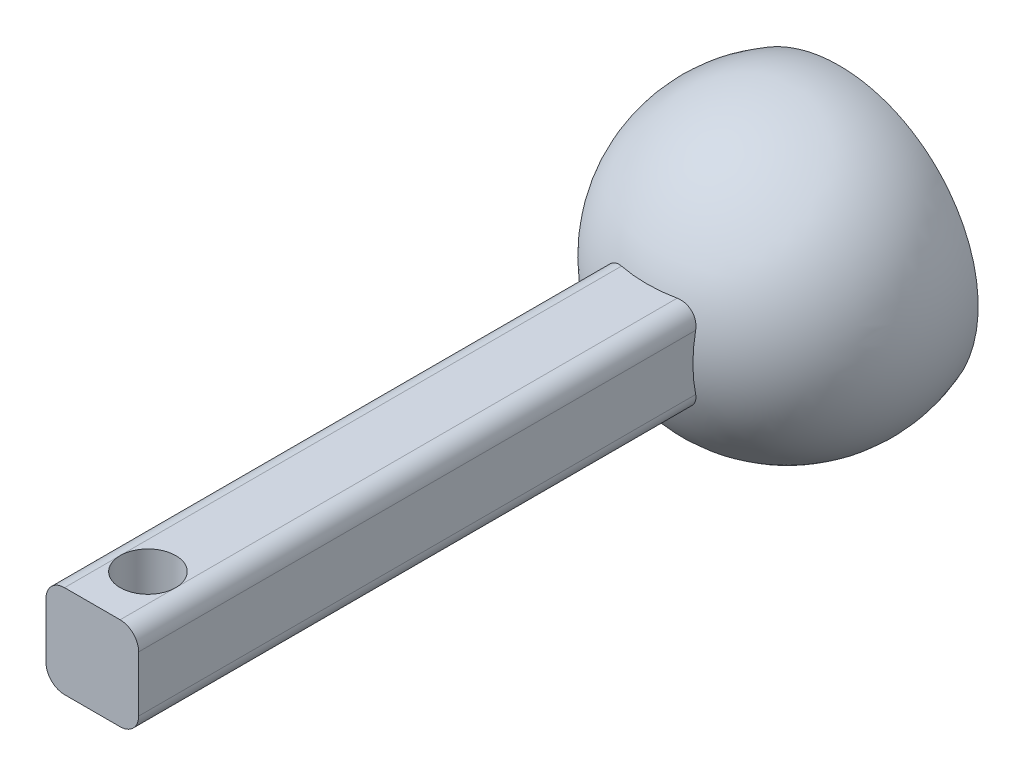
ISO-10303-21;
HEADER;
FILE_DESCRIPTION(('STEP AP214'),'2;1');
FILE_NAME('part.step','',(''),(''),'','','');
FILE_SCHEMA(('AUTOMOTIVE_DESIGN { 1 0 10303 214 1 1 1 1 }'));
ENDSEC;
DATA;
#1=APPLICATION_CONTEXT('core data for automotive mechanical design processes');
#2=APPLICATION_PROTOCOL_DEFINITION('international standard','automotive_design',2000,#1);
#3=PRODUCT_CONTEXT('',#1,'mechanical');
#4=PRODUCT('Part','Part','',(#3));
#5=PRODUCT_RELATED_PRODUCT_CATEGORY('part','',(#4));
#6=PRODUCT_DEFINITION_FORMATION('','',#4);
#7=PRODUCT_DEFINITION_CONTEXT('part definition',#1,'design');
#8=PRODUCT_DEFINITION('design','',#6,#7);
#9=PRODUCT_DEFINITION_SHAPE('','',#8);
#10=(LENGTH_UNIT() NAMED_UNIT(*) SI_UNIT(.MILLI.,.METRE.));
#11=(NAMED_UNIT(*) PLANE_ANGLE_UNIT() SI_UNIT($,.RADIAN.));
#12=(NAMED_UNIT(*) SI_UNIT($,.STERADIAN.) SOLID_ANGLE_UNIT());
#13=UNCERTAINTY_MEASURE_WITH_UNIT(LENGTH_MEASURE(1.E-05),#10,'distance_accuracy_value','');
#14=(GEOMETRIC_REPRESENTATION_CONTEXT(3) GLOBAL_UNCERTAINTY_ASSIGNED_CONTEXT((#13)) GLOBAL_UNIT_ASSIGNED_CONTEXT((#10,
#11,#12)) REPRESENTATION_CONTEXT('',''));
#15=CARTESIAN_POINT('',(0.,0.,0.));
#16=DIRECTION('',(0.,0.,1.));
#17=DIRECTION('',(1.,0.,0.));
#18=AXIS2_PLACEMENT_3D('',#15,#16,#17);
#19=CARTESIAN_POINT('',(1.90972222222197,4.70138888888889,37.5));
#20=DIRECTION('',(0.,-1.,0.));
#21=DIRECTION('',(0.,0.,-1.));
#22=AXIS2_PLACEMENT_3D('',#19,#20,#21);
#23=PLANE('',#22);
#24=DIRECTION('',(-1.,0.,0.));
#25=VECTOR('',#24,1.);
#26=CARTESIAN_POINT('',(1.90972222222197,4.70138888888889,37.5));
#27=LINE('',#26,#25);
#28=CARTESIAN_POINT('',(0.909722222221967,4.70138888888889,37.5));
#29=VERTEX_POINT('',#28);
#30=CARTESIAN_POINT('',(-2.09027777777803,4.70138888888889,37.5));
#31=VERTEX_POINT('',#30);
#32=EDGE_CURVE('E196',#29,#31,#27,.T.);
#33=ORIENTED_EDGE('',*,*,#32,.T.);
#34=DIRECTION('',(0.,0.,-1.));
#35=VECTOR('',#34,1.);
#36=CARTESIAN_POINT('',(-2.09027777777803,4.70138888888889,37.5));
#37=LINE('',#36,#35);
#38=CARTESIAN_POINT('',(-2.09027777777801,4.70138888888889,34.5));
#39=VERTEX_POINT('',#38);
#40=EDGE_CURVE('E188',#31,#39,#37,.T.);
#41=ORIENTED_EDGE('',*,*,#40,.T.);
#42=CARTESIAN_POINT('',(-0.590277777778033,4.70138888888889,34.5));
#43=DIRECTION('',(0.,-1.,0.));
#44=DIRECTION('',(0.,0.,-1.));
#45=AXIS2_PLACEMENT_3D('',#42,#43,#44);
#46=CIRCLE('',#45,1.5);
#47=CARTESIAN_POINT('',(0.909722222221988,4.70138888888889,34.5));
#48=VERTEX_POINT('',#47);
#49=EDGE_CURVE('E225',#48,#39,#46,.T.);
#50=ORIENTED_EDGE('',*,*,#49,.F.);
#51=DIRECTION('',(0.,0.,-1.));
#52=VECTOR('',#51,1.);
#53=CARTESIAN_POINT('',(0.909722222221967,4.70138888888889,37.5));
#54=LINE('',#53,#52);
#55=EDGE_CURVE('E174',#48,#29,#54,.F.);
#56=ORIENTED_EDGE('',*,*,#55,.T.);
#57=EDGE_LOOP('',(#33,#41,#50,#56));
#58=FACE_BOUND('',#57,.T.);
#59=ADVANCED_FACE('F33',(#58),#23,.T.);
#60=CARTESIAN_POINT('',(1.90972222222197,9.70138888888889,37.5));
#61=DIRECTION('',(0.,1.,0.));
#62=DIRECTION('',(0.,0.,1.));
#63=AXIS2_PLACEMENT_3D('',#60,#61,#62);
#64=PLANE('',#63);
#65=DIRECTION('',(1.,0.,0.));
#66=VECTOR('',#65,1.);
#67=CARTESIAN_POINT('',(1.90972222222197,9.70138888888889,37.5));
#68=LINE('',#67,#66);
#69=CARTESIAN_POINT('',(-2.09027777777803,9.70138888888889,37.5));
#70=VERTEX_POINT('',#69);
#71=CARTESIAN_POINT('',(0.909722222221968,9.70138888888889,37.5));
#72=VERTEX_POINT('',#71);
#73=EDGE_CURVE('E220',#70,#72,#68,.T.);
#74=ORIENTED_EDGE('',*,*,#73,.T.);
#75=DIRECTION('',(0.,0.,-1.));
#76=VECTOR('',#75,1.);
#77=CARTESIAN_POINT('',(0.909722222221968,9.70138888888889,37.5));
#78=LINE('',#77,#76);
#79=CARTESIAN_POINT('',(0.909722222221989,9.70138888888889,34.5));
#80=VERTEX_POINT('',#79);
#81=EDGE_CURVE('E237',#72,#80,#78,.T.);
#82=ORIENTED_EDGE('',*,*,#81,.T.);
#83=CARTESIAN_POINT('',(-0.590277777778033,9.70138888888889,34.5));
#84=DIRECTION('',(0.,-1.,0.));
#85=DIRECTION('',(0.,0.,-1.));
#86=AXIS2_PLACEMENT_3D('',#83,#84,#85);
#87=CIRCLE('',#86,1.5);
#88=CARTESIAN_POINT('',(-2.09027777777801,9.70138888888889,34.5));
#89=VERTEX_POINT('',#88);
#90=EDGE_CURVE('E227',#80,#89,#87,.T.);
#91=ORIENTED_EDGE('',*,*,#90,.T.);
#92=DIRECTION('',(0.,0.,-1.));
#93=VECTOR('',#92,1.);
#94=CARTESIAN_POINT('',(-2.09027777777803,9.70138888888889,37.5));
#95=LINE('',#94,#93);
#96=EDGE_CURVE('E137',#89,#70,#95,.F.);
#97=ORIENTED_EDGE('',*,*,#96,.T.);
#98=EDGE_LOOP('',(#74,#82,#91,#97));
#99=FACE_BOUND('',#98,.T.);
#100=ADVANCED_FACE('F234',(#99),#64,.T.);
#101=CARTESIAN_POINT('',(-0.590277777777771,7.20138888888889,0.));
#102=DIRECTION('',(0.,1.,0.));
#103=DIRECTION('',(-1.,0.,0.));
#104=AXIS2_PLACEMENT_3D('',#101,#102,#103);
#105=SPHERICAL_SURFACE('',#104,8.);
#106=CARTESIAN_POINT('',(1.90972222222223,7.20138888888889,0.));
#107=DIRECTION('',(1.,0.,0.));
#108=DIRECTION('',(0.,0.,-1.));
#109=AXIS2_PLACEMENT_3D('',#106,#107,#108);
#110=CIRCLE('',#109,7.59934207678533);
#111=CARTESIAN_POINT('',(1.90972222222218,8.70138888888889,7.44983221287569));
#112=VERTEX_POINT('',#111);
#113=CARTESIAN_POINT('',(1.90972222222218,5.70138888888889,7.44983221287569));
#114=VERTEX_POINT('',#113);
#115=EDGE_CURVE('E213',#112,#114,#110,.T.);
#116=ORIENTED_EDGE('',*,*,#115,.T.);
#117=CARTESIAN_POINT('',(1.90972222222218,5.70138888888889,7.44983221287569));
#118=CARTESIAN_POINT('',(1.90972187952674,5.67401608297487,7.44432086557203));
#119=CARTESIAN_POINT('',(1.90859752282679,5.64661207920893,7.4390234146982));
#120=CARTESIAN_POINT('',(1.90408975405537,5.59190063470269,7.42889347449714));
#121=CARTESIAN_POINT('',(1.90070603824714,5.56459320744193,7.42406104778535));
#122=CARTESIAN_POINT('',(1.8871545453131,5.48309417147811,7.41032406944411));
#123=CARTESIAN_POINT('',(1.87358644409308,5.42929646140758,7.40217390010411));
#124=CARTESIAN_POINT('',(1.83759111737496,5.32436974699586,7.38819228477517));
#125=CARTESIAN_POINT('',(1.81515183130401,5.27324448348864,7.38236401721117));
#126=CARTESIAN_POINT('',(1.76196698992378,5.17528972496734,7.37326176833674));
#127=CARTESIAN_POINT('',(1.73122666988414,5.12845754725445,7.36998618215187));
#128=CARTESIAN_POINT('',(1.66305627572989,5.04148400928918,7.36615821402901));
#129=CARTESIAN_POINT('',(1.62578803100067,5.00121824656301,7.36554757867138));
#130=CARTESIAN_POINT('',(1.54519446237612,4.92733264834072,7.36691353307779));
#131=CARTESIAN_POINT('',(1.50186869546854,4.89371329935948,7.36889031215891));
#132=CARTESIAN_POINT('',(1.41094871784058,4.83438962278865,7.37531916336286));
#133=CARTESIAN_POINT('',(1.36340586145067,4.80860345596496,7.37974417422791));
#134=CARTESIAN_POINT('',(1.26501170452694,4.76508643746949,7.39089000393251));
#135=CARTESIAN_POINT('',(1.21416034745024,4.74735572350822,7.39761086201687));
#136=CARTESIAN_POINT('',(1.12096500103,4.72301757045456,7.41155826367819));
#137=CARTESIAN_POINT('',(1.07895217399709,4.71489518863995,7.41841521879768));
#138=CARTESIAN_POINT('',(0.994500082224868,4.70407815911373,7.43328928099236));
#139=CARTESIAN_POINT('',(0.952061543510614,4.70137546797849,7.4413046498695));
#140=CARTESIAN_POINT('',(0.909722222222177,4.70138888888889,7.44983221287568));
#141=B_SPLINE_CURVE_WITH_KNOTS('',3,(#117,#118,#119,#120,#121,#122,#123,#124,#125,#126,#127,
#128,#129,#130,#131,#132,#133,#134,#135,#136,#137,#138,#139,#140),.UNSPECIFIED.,.F.,.F.,(4,2,2,
2,2,2,2,2,2,2,2,4),(0.,0.0837187567447226,0.167448770480679,0.334820094500676,0.502419750395049,
0.669913950947328,0.833727934721913,0.997553905179925,1.15960421039522,1.32165728580771,
1.45131918122507,1.58078850112919),.UNSPECIFIED.);
#142=CARTESIAN_POINT('',(0.909722222222177,4.70138888888889,7.44983221287568));
#143=VERTEX_POINT('',#142);
#144=EDGE_CURVE('E181',#114,#143,#141,.T.);
#145=ORIENTED_EDGE('',*,*,#144,.T.);
#146=CARTESIAN_POINT('',(-0.590277777777771,4.70138888888889,0.));
#147=DIRECTION('',(0.,-1.,0.));
#148=DIRECTION('',(0.,0.,-1.));
#149=AXIS2_PLACEMENT_3D('',#146,#147,#148);
#150=CIRCLE('',#149,7.59934207678533);
#151=CARTESIAN_POINT('',(-2.09027777777782,4.70138888888889,7.44983221287566));
#152=VERTEX_POINT('',#151);
#153=EDGE_CURVE('E121',#143,#152,#150,.T.);
#154=ORIENTED_EDGE('',*,*,#153,.T.);
#155=CARTESIAN_POINT('',(-2.09027777777782,4.70138888888889,7.44983221287566));
#156=CARTESIAN_POINT('',(-2.11765058369184,4.70138923158433,7.444320865572));
#157=CARTESIAN_POINT('',(-2.14505458745779,4.70251358828428,7.43902341469817));
#158=CARTESIAN_POINT('',(-2.19976603196402,4.7070213570557,7.42889347449711));
#159=CARTESIAN_POINT('',(-2.22707345922479,4.71040507286393,7.42406104778532));
#160=CARTESIAN_POINT('',(-2.3085724951886,4.72395656579797,7.41032406944408));
#161=CARTESIAN_POINT('',(-2.36237020525914,4.73752466701799,7.40217390010408));
#162=CARTESIAN_POINT('',(-2.46729691967086,4.77351999373611,7.38819228477514));
#163=CARTESIAN_POINT('',(-2.51842218317807,4.79595927980706,7.38236401721114));
#164=CARTESIAN_POINT('',(-2.61637694169938,4.84914412118729,7.37326176833671));
#165=CARTESIAN_POINT('',(-2.66320911941227,4.87988444122693,7.36998618215184));
#166=CARTESIAN_POINT('',(-2.75018265737753,4.94805483538118,7.36615821402898));
#167=CARTESIAN_POINT('',(-2.7904484201037,4.9853230801104,7.36554757867135));
#168=CARTESIAN_POINT('',(-2.864334018326,5.06591664873495,7.36691353307776));
#169=CARTESIAN_POINT('',(-2.89795336730723,5.10924241564253,7.36889031215888));
#170=CARTESIAN_POINT('',(-2.95727704387807,5.20016239327049,7.37531916336284));
#171=CARTESIAN_POINT('',(-2.98306321070175,5.2477052496604,7.37974417422788));
#172=CARTESIAN_POINT('',(-3.02658022919722,5.34609940658413,7.39089000393248));
#173=CARTESIAN_POINT('',(-3.04431094315849,5.39695076366083,7.39761086201684));
#174=CARTESIAN_POINT('',(-3.06864909621216,5.49014611008107,7.41155826367816));
#175=CARTESIAN_POINT('',(-3.07677147802676,5.53215893711398,7.41841521879765));
#176=CARTESIAN_POINT('',(-3.08758850755298,5.6166110288862,7.43328928099233));
#177=CARTESIAN_POINT('',(-3.09029119868822,5.65904956760046,7.44130464986947));
#178=CARTESIAN_POINT('',(-3.09027777777782,5.70138888888889,7.44983221287565));
#179=B_SPLINE_CURVE_WITH_KNOTS('',3,(#155,#156,#157,#158,#159,#160,#161,#162,#163,#164,#165,
#166,#167,#168,#169,#170,#171,#172,#173,#174,#175,#176,#177,#178),.UNSPECIFIED.,.F.,.F.,(4,2,2,
2,2,2,2,2,2,2,2,4),(0.,0.0837187567447233,0.167448770480679,0.334820094500676,0.502419750395046,
0.669913950947327,0.833727934721913,0.997553905179924,1.15960421039522,1.32165728580771,
1.45131918122507,1.58078850112919),.UNSPECIFIED.);
#180=CARTESIAN_POINT('',(-3.09027777777782,5.70138888888889,7.44983221287565));
#181=VERTEX_POINT('',#180);
#182=EDGE_CURVE('E11',#152,#181,#179,.T.);
#183=ORIENTED_EDGE('',*,*,#182,.T.);
#184=CARTESIAN_POINT('',(-3.09027777777777,7.20138888888889,0.));
#185=DIRECTION('',(-1.,0.,0.));
#186=DIRECTION('',(0.,0.,1.));
#187=AXIS2_PLACEMENT_3D('',#184,#185,#186);
#188=CIRCLE('',#187,7.59934207678533);
#189=CARTESIAN_POINT('',(-3.09027777777782,8.70138888888889,7.44983221287565));
#190=VERTEX_POINT('',#189);
#191=EDGE_CURVE('E111',#181,#190,#188,.T.);
#192=ORIENTED_EDGE('',*,*,#191,.T.);
#193=CARTESIAN_POINT('',(-3.09027777777782,8.70138888888889,7.44983221287565));
#194=CARTESIAN_POINT('',(-3.09027743508239,8.72876169480291,7.444320865572));
#195=CARTESIAN_POINT('',(-3.08915307838244,8.75616569856886,7.43902341469817));
#196=CARTESIAN_POINT('',(-3.08464530961102,8.81087714307509,7.42889347449711));
#197=CARTESIAN_POINT('',(-3.08126159380278,8.83818457033586,7.42406104778531));
#198=CARTESIAN_POINT('',(-3.06771010086874,8.91968360629967,7.41032406944408));
#199=CARTESIAN_POINT('',(-3.05414199964873,8.9734813163702,7.40217390010408));
#200=CARTESIAN_POINT('',(-3.01814667293061,9.07840803078193,7.38819228477514));
#201=CARTESIAN_POINT('',(-2.99570738685965,9.12953329428914,7.38236401721114));
#202=CARTESIAN_POINT('',(-2.94252254547942,9.22748805281044,7.37326176833671));
#203=CARTESIAN_POINT('',(-2.91178222543979,9.27432023052333,7.36998618215184));
#204=CARTESIAN_POINT('',(-2.84361183128554,9.36129376848859,7.36615821402898));
#205=CARTESIAN_POINT('',(-2.80634358655631,9.40155953121477,7.36554757867135));
#206=CARTESIAN_POINT('',(-2.72575001793177,9.47544512943707,7.36691353307776));
#207=CARTESIAN_POINT('',(-2.68242425102418,9.5090644784183,7.36889031215889));
#208=CARTESIAN_POINT('',(-2.59150427339622,9.56838815498914,7.37531916336284));
#209=CARTESIAN_POINT('',(-2.54396141700631,9.59417432181282,7.37974417422788));
#210=CARTESIAN_POINT('',(-2.44556726008258,9.63769134030829,7.39089000393248));
#211=CARTESIAN_POINT('',(-2.39471590300588,9.65542205426956,7.39761086201684));
#212=CARTESIAN_POINT('',(-2.30152055658565,9.67976020732322,7.41155826367816));
#213=CARTESIAN_POINT('',(-2.25950772955274,9.68788258913783,7.41841521879765));
#214=CARTESIAN_POINT('',(-2.17505563778051,9.69869961866405,7.43328928099234));
#215=CARTESIAN_POINT('',(-2.13261709906626,9.70140230979929,7.44130464986948));
#216=CARTESIAN_POINT('',(-2.09027777777782,9.70138888888889,7.44983221287566));
#217=B_SPLINE_CURVE_WITH_KNOTS('',3,(#193,#194,#195,#196,#197,#198,#199,#200,#201,#202,#203,
#204,#205,#206,#207,#208,#209,#210,#211,#212,#213,#214,#215,#216),.UNSPECIFIED.,.F.,.F.,(4,2,2,
2,2,2,2,2,2,2,2,4),(0.,0.0837187567447224,0.16744877048068,0.334820094500676,0.502419750395044,
0.669913950947324,0.833727934721911,0.997553905179923,1.15960421039522,1.32165728580771,
1.45131918122507,1.58078850112919),.UNSPECIFIED.);
#218=CARTESIAN_POINT('',(-2.09027777777782,9.70138888888889,7.44983221287566));
#219=VERTEX_POINT('',#218);
#220=EDGE_CURVE('E117',#190,#219,#217,.T.);
#221=ORIENTED_EDGE('',*,*,#220,.T.);
#222=CARTESIAN_POINT('',(-0.590277777777771,9.70138888888889,0.));
#223=DIRECTION('',(0.,1.,0.));
#224=DIRECTION('',(0.,0.,1.));
#225=AXIS2_PLACEMENT_3D('',#222,#223,#224);
#226=CIRCLE('',#225,7.59934207678533);
#227=CARTESIAN_POINT('',(0.909722222222177,9.70138888888889,7.44983221287568));
#228=VERTEX_POINT('',#227);
#229=EDGE_CURVE('E204',#219,#228,#226,.T.);
#230=ORIENTED_EDGE('',*,*,#229,.T.);
#231=CARTESIAN_POINT('',(0.909722222222178,9.70138888888889,7.44983221287568));
#232=CARTESIAN_POINT('',(0.937095028136199,9.70138854619345,7.44432086557202));
#233=CARTESIAN_POINT('',(0.964499031902143,9.7002641894935,7.43902341469819));
#234=CARTESIAN_POINT('',(1.01921047640838,9.69575642072209,7.42889347449714));
#235=CARTESIAN_POINT('',(1.04651790366914,9.69237270491385,7.42406104778534));
#236=CARTESIAN_POINT('',(1.12801693963296,9.67882121197981,7.4103240694441));
#237=CARTESIAN_POINT('',(1.18181464970349,9.6652531107598,7.40217390010411));
#238=CARTESIAN_POINT('',(1.28674136411521,9.62925778404168,7.38819228477517));
#239=CARTESIAN_POINT('',(1.33786662762242,9.60681849797072,7.38236401721117));
#240=CARTESIAN_POINT('',(1.43582138614373,9.55363365659049,7.37326176833674));
#241=CARTESIAN_POINT('',(1.48265356385662,9.52289333655085,7.36998618215187));
#242=CARTESIAN_POINT('',(1.56962710182188,9.4547229423966,7.36615821402901));
#243=CARTESIAN_POINT('',(1.60989286454806,9.41745469766738,7.36554757867138));
#244=CARTESIAN_POINT('',(1.68377846277035,9.33686112904283,7.36691353307779));
#245=CARTESIAN_POINT('',(1.71739781175159,9.29353536213525,7.36889031215892));
#246=CARTESIAN_POINT('',(1.77672148832242,9.20261538450729,7.37531916336287));
#247=CARTESIAN_POINT('',(1.80250765514611,9.15507252811738,7.37974417422791));
#248=CARTESIAN_POINT('',(1.84602467364158,9.05667837119365,7.39089000393251));
#249=CARTESIAN_POINT('',(1.86375538760285,9.00582701411695,7.39761086201687));
#250=CARTESIAN_POINT('',(1.88809354065651,8.91263166769672,7.41155826367819));
#251=CARTESIAN_POINT('',(1.89621592247112,8.8706188406638,7.41841521879768));
#252=CARTESIAN_POINT('',(1.90703295199734,8.78616674889158,7.43328928099237));
#253=CARTESIAN_POINT('',(1.90973564313258,8.74372821017733,7.44130464986951));
#254=CARTESIAN_POINT('',(1.90972222222218,8.70138888888889,7.44983221287569));
#255=B_SPLINE_CURVE_WITH_KNOTS('',3,(#231,#232,#233,#234,#235,#236,#237,#238,#239,#240,#241,
#242,#243,#244,#245,#246,#247,#248,#249,#250,#251,#252,#253,#254),.UNSPECIFIED.,.F.,.F.,(4,2,2,
2,2,2,2,2,2,2,2,4),(0.,0.0837187567447231,0.167448770480679,0.334820094500677,0.502419750395047,
0.669913950947328,0.833727934721914,0.997553905179926,1.15960421039523,1.32165728580771,
1.45131918122507,1.58078850112919),.UNSPECIFIED.);
#256=EDGE_CURVE('E163',#228,#112,#255,.T.);
#257=ORIENTED_EDGE('',*,*,#256,.T.);
#258=EDGE_LOOP('',(#116,#145,#154,#183,#192,#221,#230,#257));
#259=FACE_BOUND('',#258,.T.);
#260=CARTESIAN_POINT('',(-0.590277777777771,7.20138888888889,-2.79776216685715));
#261=DIRECTION('',(0.,0.,-1.));
#262=DIRECTION('',(-1.,0.,0.));
#263=AXIS2_PLACEMENT_3D('',#260,#261,#262);
#264=CIRCLE('',#263,7.49483334422473);
#265=CARTESIAN_POINT('',(-8.0851111220025,7.20138888888889,-2.79776216685715));
#266=VERTEX_POINT('',#265);
#267=EDGE_CURVE('E141',#266,#266,#264,.T.);
#268=ORIENTED_EDGE('',*,*,#267,.F.);
#269=EDGE_LOOP('',(#268));
#270=FACE_BOUND('',#269,.T.);
#271=ADVANCED_FACE('F114',(#259,#270),#105,.T.);
#272=CARTESIAN_POINT('',(-3.09027777777803,9.70138888888889,37.5));
#273=DIRECTION('',(-1.,0.,0.));
#274=DIRECTION('',(0.,0.,1.));
#275=AXIS2_PLACEMENT_3D('',#272,#273,#274);
#276=PLANE('',#275);
#277=ORIENTED_EDGE('',*,*,#191,.F.);
#278=DIRECTION('',(0.,0.,-1.));
#279=VECTOR('',#278,1.);
#280=CARTESIAN_POINT('',(-3.09027777777803,5.70138888888889,37.5));
#281=LINE('',#280,#279);
#282=CARTESIAN_POINT('',(-3.09027777777803,5.70138888888889,37.5));
#283=VERTEX_POINT('',#282);
#284=EDGE_CURVE('E58',#181,#283,#281,.F.);
#285=ORIENTED_EDGE('',*,*,#284,.T.);
#286=DIRECTION('',(0.,1.,0.));
#287=VECTOR('',#286,1.);
#288=CARTESIAN_POINT('',(-3.09027777777803,9.70138888888889,37.5));
#289=LINE('',#288,#287);
#290=CARTESIAN_POINT('',(-3.09027777777803,8.70138888888889,37.5));
#291=VERTEX_POINT('',#290);
#292=EDGE_CURVE('E135',#283,#291,#289,.T.);
#293=ORIENTED_EDGE('',*,*,#292,.T.);
#294=DIRECTION('',(0.,0.,-1.));
#295=VECTOR('',#294,1.);
#296=CARTESIAN_POINT('',(-3.09027777777803,8.70138888888889,37.5));
#297=LINE('',#296,#295);
#298=EDGE_CURVE('E120',#291,#190,#297,.T.);
#299=ORIENTED_EDGE('',*,*,#298,.T.);
#300=EDGE_LOOP('',(#277,#285,#293,#299));
#301=FACE_BOUND('',#300,.T.);
#302=ADVANCED_FACE('F134',(#301),#276,.T.);
#303=EDGE_CURVE('E211',#39,#48,#46,.T.);
#304=ORIENTED_EDGE('',*,*,#303,.F.);
#305=DIRECTION('',(0.,0.,-1.));
#306=VECTOR('',#305,1.);
#307=CARTESIAN_POINT('',(-2.09027777777803,4.70138888888889,37.5));
#308=LINE('',#307,#306);
#309=EDGE_CURVE('E186',#39,#152,#308,.T.);
#310=ORIENTED_EDGE('',*,*,#309,.T.);
#311=ORIENTED_EDGE('',*,*,#153,.F.);
#312=DIRECTION('',(0.,0.,-1.));
#313=VECTOR('',#312,1.);
#314=CARTESIAN_POINT('',(0.909722222221967,4.70138888888889,37.5));
#315=LINE('',#314,#313);
#316=EDGE_CURVE('E176',#143,#48,#315,.F.);
#317=ORIENTED_EDGE('',*,*,#316,.T.);
#318=EDGE_LOOP('',(#304,#310,#311,#317));
#319=FACE_BOUND('',#318,.T.);
#320=ADVANCED_FACE('F209',(#319),#23,.T.);
#321=CARTESIAN_POINT('',(1.90972222222197,9.70138888888889,37.5));
#322=DIRECTION('',(1.,0.,0.));
#323=DIRECTION('',(0.,0.,-1.));
#324=AXIS2_PLACEMENT_3D('',#321,#322,#323);
#325=PLANE('',#324);
#326=DIRECTION('',(0.,-1.,0.));
#327=VECTOR('',#326,1.);
#328=CARTESIAN_POINT('',(1.90972222222197,9.70138888888889,37.5));
#329=LINE('',#328,#327);
#330=CARTESIAN_POINT('',(1.90972222222197,8.70138888888889,37.5));
#331=VERTEX_POINT('',#330);
#332=CARTESIAN_POINT('',(1.90972222222197,5.70138888888889,37.5));
#333=VERTEX_POINT('',#332);
#334=EDGE_CURVE('E205',#331,#333,#329,.T.);
#335=ORIENTED_EDGE('',*,*,#334,.T.);
#336=DIRECTION('',(0.,0.,-1.));
#337=VECTOR('',#336,1.);
#338=CARTESIAN_POINT('',(1.90972222222197,5.70138888888889,37.5));
#339=LINE('',#338,#337);
#340=EDGE_CURVE('E169',#333,#114,#339,.T.);
#341=ORIENTED_EDGE('',*,*,#340,.T.);
#342=ORIENTED_EDGE('',*,*,#115,.F.);
#343=DIRECTION('',(0.,0.,-1.));
#344=VECTOR('',#343,1.);
#345=CARTESIAN_POINT('',(1.90972222222197,8.70138888888889,37.5));
#346=LINE('',#345,#344);
#347=EDGE_CURVE('E246',#112,#331,#346,.F.);
#348=ORIENTED_EDGE('',*,*,#347,.T.);
#349=EDGE_LOOP('',(#335,#341,#342,#348));
#350=FACE_BOUND('',#349,.T.);
#351=ADVANCED_FACE('F249',(#350),#325,.T.);
#352=EDGE_CURVE('E224',#89,#80,#87,.T.);
#353=ORIENTED_EDGE('',*,*,#352,.T.);
#354=DIRECTION('',(0.,0.,-1.));
#355=VECTOR('',#354,1.);
#356=CARTESIAN_POINT('',(0.909722222221968,9.70138888888889,37.5));
#357=LINE('',#356,#355);
#358=EDGE_CURVE('E131',#80,#228,#357,.T.);
#359=ORIENTED_EDGE('',*,*,#358,.T.);
#360=ORIENTED_EDGE('',*,*,#229,.F.);
#361=DIRECTION('',(0.,0.,-1.));
#362=VECTOR('',#361,1.);
#363=CARTESIAN_POINT('',(-2.09027777777803,9.70138888888889,37.5));
#364=LINE('',#363,#362);
#365=EDGE_CURVE('E130',#219,#89,#364,.F.);
#366=ORIENTED_EDGE('',*,*,#365,.T.);
#367=EDGE_LOOP('',(#353,#359,#360,#366));
#368=FACE_BOUND('',#367,.T.);
#369=ADVANCED_FACE('F239',(#368),#64,.T.);
#370=CARTESIAN_POINT('',(-2.61861100413235E-13,0.,37.5));
#371=DIRECTION('',(0.,0.,-1.));
#372=DIRECTION('',(-1.,0.,0.));
#373=AXIS2_PLACEMENT_3D('',#370,#371,#372);
#374=PLANE('',#373);
#375=ORIENTED_EDGE('',*,*,#292,.F.);
#376=CARTESIAN_POINT('',(-2.09027777777803,5.70138888888889,37.5));
#377=DIRECTION('',(0.,0.,-1.));
#378=DIRECTION('',(-1.,0.,0.));
#379=AXIS2_PLACEMENT_3D('',#376,#377,#378);
#380=CIRCLE('',#379,1.);
#381=EDGE_CURVE('E46',#283,#31,#380,.F.);
#382=ORIENTED_EDGE('',*,*,#381,.T.);
#383=ORIENTED_EDGE('',*,*,#32,.F.);
#384=CARTESIAN_POINT('',(0.909722222221967,5.70138888888889,37.5));
#385=DIRECTION('',(0.,0.,-1.));
#386=DIRECTION('',(-1.,0.,0.));
#387=AXIS2_PLACEMENT_3D('',#384,#385,#386);
#388=CIRCLE('',#387,1.);
#389=EDGE_CURVE('E179',#29,#333,#388,.F.);
#390=ORIENTED_EDGE('',*,*,#389,.T.);
#391=ORIENTED_EDGE('',*,*,#334,.F.);
#392=CARTESIAN_POINT('',(0.909722222221968,8.70138888888889,37.5));
#393=DIRECTION('',(0.,0.,-1.));
#394=DIRECTION('',(-1.,0.,0.));
#395=AXIS2_PLACEMENT_3D('',#392,#393,#394);
#396=CIRCLE('',#395,1.);
#397=EDGE_CURVE('E170',#331,#72,#396,.F.);
#398=ORIENTED_EDGE('',*,*,#397,.T.);
#399=ORIENTED_EDGE('',*,*,#73,.F.);
#400=CARTESIAN_POINT('',(-2.09027777777803,8.70138888888889,37.5));
#401=DIRECTION('',(0.,0.,-1.));
#402=DIRECTION('',(-1.,0.,0.));
#403=AXIS2_PLACEMENT_3D('',#400,#401,#402);
#404=CIRCLE('',#403,1.);
#405=EDGE_CURVE('E132',#70,#291,#404,.F.);
#406=ORIENTED_EDGE('',*,*,#405,.T.);
#407=EDGE_LOOP('',(#375,#382,#383,#390,#391,#398,#399,#406));
#408=FACE_BOUND('',#407,.T.);
#409=ADVANCED_FACE('F195',(#408),#374,.F.);
#410=CARTESIAN_POINT('',(-0.590277777778033,9.70138888888889,34.5));
#411=DIRECTION('',(0.,-1.,0.));
#412=DIRECTION('',(0.,0.,-1.));
#413=AXIS2_PLACEMENT_3D('',#410,#411,#412);
#414=CYLINDRICAL_SURFACE('',#413,1.5);
#415=ORIENTED_EDGE('',*,*,#352,.F.);
#416=ORIENTED_EDGE('',*,*,#90,.F.);
#417=EDGE_LOOP('',(#415,#416));
#418=FACE_BOUND('',#417,.T.);
#419=ORIENTED_EDGE('',*,*,#49,.T.);
#420=ORIENTED_EDGE('',*,*,#303,.T.);
#421=EDGE_LOOP('',(#419,#420));
#422=FACE_BOUND('',#421,.T.);
#423=ADVANCED_FACE('F240',(#418,#422),#414,.F.);
#424=CARTESIAN_POINT('',(0.,0.,-2.79776216685715));
#425=DIRECTION('',(0.,0.,-1.));
#426=DIRECTION('',(-1.,0.,0.));
#427=AXIS2_PLACEMENT_3D('',#424,#425,#426);
#428=PLANE('',#427);
#429=ORIENTED_EDGE('',*,*,#267,.T.);
#430=EDGE_LOOP('',(#429));
#431=FACE_BOUND('',#430,.T.);
#432=ADVANCED_FACE('F156',(#431),#428,.T.);
#433=CARTESIAN_POINT('',(-2.09027777777803,8.70138888888889,37.5));
#434=DIRECTION('',(0.,0.,-1.));
#435=DIRECTION('',(-1.,0.,0.));
#436=AXIS2_PLACEMENT_3D('',#433,#434,#435);
#437=CYLINDRICAL_SURFACE('',#436,1.);
#438=ORIENTED_EDGE('',*,*,#96,.F.);
#439=ORIENTED_EDGE('',*,*,#365,.F.);
#440=ORIENTED_EDGE('',*,*,#220,.F.);
#441=ORIENTED_EDGE('',*,*,#298,.F.);
#442=ORIENTED_EDGE('',*,*,#405,.F.);
#443=EDGE_LOOP('',(#438,#439,#440,#441,#442));
#444=FACE_BOUND('',#443,.T.);
#445=ADVANCED_FACE('F127',(#444),#437,.T.);
#446=CARTESIAN_POINT('',(0.909722222221968,8.70138888888889,37.5));
#447=DIRECTION('',(0.,0.,-1.));
#448=DIRECTION('',(-1.,0.,0.));
#449=AXIS2_PLACEMENT_3D('',#446,#447,#448);
#450=CYLINDRICAL_SURFACE('',#449,1.);
#451=ORIENTED_EDGE('',*,*,#397,.F.);
#452=ORIENTED_EDGE('',*,*,#347,.F.);
#453=ORIENTED_EDGE('',*,*,#256,.F.);
#454=ORIENTED_EDGE('',*,*,#358,.F.);
#455=ORIENTED_EDGE('',*,*,#81,.F.);
#456=EDGE_LOOP('',(#451,#452,#453,#454,#455));
#457=FACE_BOUND('',#456,.T.);
#458=ADVANCED_FACE('F155',(#457),#450,.T.);
#459=CARTESIAN_POINT('',(0.909722222221967,5.70138888888889,37.5));
#460=DIRECTION('',(0.,0.,-1.));
#461=DIRECTION('',(-1.,0.,0.));
#462=AXIS2_PLACEMENT_3D('',#459,#460,#461);
#463=CYLINDRICAL_SURFACE('',#462,1.);
#464=ORIENTED_EDGE('',*,*,#55,.F.);
#465=ORIENTED_EDGE('',*,*,#316,.F.);
#466=ORIENTED_EDGE('',*,*,#144,.F.);
#467=ORIENTED_EDGE('',*,*,#340,.F.);
#468=ORIENTED_EDGE('',*,*,#389,.F.);
#469=EDGE_LOOP('',(#464,#465,#466,#467,#468));
#470=FACE_BOUND('',#469,.T.);
#471=ADVANCED_FACE('F159',(#470),#463,.T.);
#472=CARTESIAN_POINT('',(-2.09027777777803,5.70138888888889,37.5));
#473=DIRECTION('',(0.,0.,-1.));
#474=DIRECTION('',(-1.,0.,0.));
#475=AXIS2_PLACEMENT_3D('',#472,#473,#474);
#476=CYLINDRICAL_SURFACE('',#475,1.);
#477=ORIENTED_EDGE('',*,*,#381,.F.);
#478=ORIENTED_EDGE('',*,*,#284,.F.);
#479=ORIENTED_EDGE('',*,*,#182,.F.);
#480=ORIENTED_EDGE('',*,*,#309,.F.);
#481=ORIENTED_EDGE('',*,*,#40,.F.);
#482=EDGE_LOOP('',(#477,#478,#479,#480,#481));
#483=FACE_BOUND('',#482,.T.);
#484=ADVANCED_FACE('F35',(#483),#476,.T.);
#485=CLOSED_SHELL('',(#59,#100,#271,#302,#320,#351,#369,#409,#423,#432,#445,#458,#471,#484));
#486=MANIFOLD_SOLID_BREP('B2',#485);
#487=ADVANCED_BREP_SHAPE_REPRESENTATION('',(#18,#486),#14);
#488=SHAPE_DEFINITION_REPRESENTATION(#9,#487);
ENDSEC;
END-ISO-10303-21;
